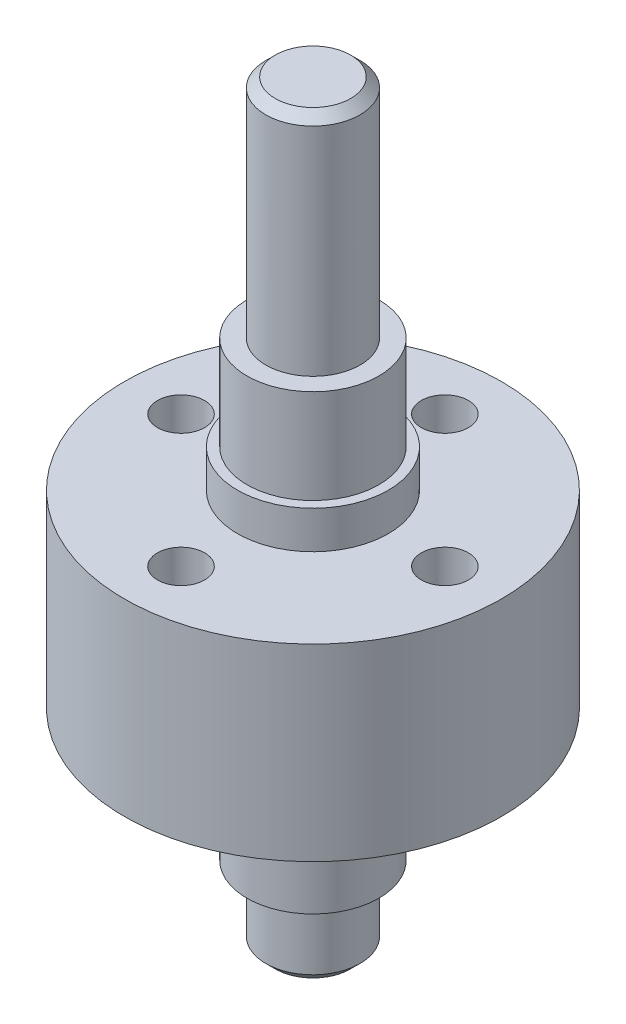
ISO-10303-21;
HEADER;
FILE_DESCRIPTION(('STEP AP214'),'2;1');
FILE_NAME('part.step','',(''),(''),'','','');
FILE_SCHEMA(('AUTOMOTIVE_DESIGN { 1 0 10303 214 1 1 1 1 }'));
ENDSEC;
DATA;
#1=APPLICATION_CONTEXT('core data for automotive mechanical design processes');
#2=APPLICATION_PROTOCOL_DEFINITION('international standard','automotive_design',2000,#1);
#3=PRODUCT_CONTEXT('',#1,'mechanical');
#4=PRODUCT('Part','Part','',(#3));
#5=PRODUCT_RELATED_PRODUCT_CATEGORY('part','',(#4));
#6=PRODUCT_DEFINITION_FORMATION('','',#4);
#7=PRODUCT_DEFINITION_CONTEXT('part definition',#1,'design');
#8=PRODUCT_DEFINITION('design','',#6,#7);
#9=PRODUCT_DEFINITION_SHAPE('','',#8);
#10=(LENGTH_UNIT() NAMED_UNIT(*) SI_UNIT(.MILLI.,.METRE.));
#11=(NAMED_UNIT(*) PLANE_ANGLE_UNIT() SI_UNIT($,.RADIAN.));
#12=(NAMED_UNIT(*) SI_UNIT($,.STERADIAN.) SOLID_ANGLE_UNIT());
#13=UNCERTAINTY_MEASURE_WITH_UNIT(LENGTH_MEASURE(1.E-05),#10,'distance_accuracy_value','');
#14=(GEOMETRIC_REPRESENTATION_CONTEXT(3) GLOBAL_UNCERTAINTY_ASSIGNED_CONTEXT((#13)) GLOBAL_UNIT_ASSIGNED_CONTEXT((#10,
#11,#12)) REPRESENTATION_CONTEXT('',''));
#15=CARTESIAN_POINT('',(0.,0.,0.));
#16=DIRECTION('',(0.,0.,1.));
#17=DIRECTION('',(1.,0.,0.));
#18=AXIS2_PLACEMENT_3D('',#15,#16,#17);
#19=CARTESIAN_POINT('',(2.5,0.,0.));
#20=DIRECTION('',(0.,-1.,0.));
#21=DIRECTION('',(0.,0.,-1.));
#22=AXIS2_PLACEMENT_3D('',#19,#20,#21);
#23=PLANE('',#22);
#24=CARTESIAN_POINT('',(0.,0.,0.));
#25=DIRECTION('',(0.,-1.,0.));
#26=DIRECTION('',(0.,0.,-1.));
#27=AXIS2_PLACEMENT_3D('',#24,#25,#26);
#28=CIRCLE('',#27,1.99999999999999);
#29=CARTESIAN_POINT('',(0.,0.,-1.99999999999999));
#30=VERTEX_POINT('',#29);
#31=EDGE_CURVE('E50',#30,#30,#28,.T.);
#32=ORIENTED_EDGE('',*,*,#31,.T.);
#33=EDGE_LOOP('',(#32));
#34=FACE_BOUND('',#33,.T.);
#35=ADVANCED_FACE('F35',(#34),#23,.T.);
#36=CARTESIAN_POINT('',(0.,40.,0.));
#37=DIRECTION('',(0.,1.,0.));
#38=DIRECTION('',(0.,0.,1.));
#39=AXIS2_PLACEMENT_3D('',#36,#37,#38);
#40=PLANE('',#39);
#41=CARTESIAN_POINT('',(0.,40.,0.));
#42=DIRECTION('',(0.,1.,0.));
#43=DIRECTION('',(0.,0.,1.));
#44=AXIS2_PLACEMENT_3D('',#41,#42,#43);
#45=CIRCLE('',#44,1.99999999999999);
#46=CARTESIAN_POINT('',(0.,40.,1.99999999999999));
#47=VERTEX_POINT('',#46);
#48=EDGE_CURVE('E10',#47,#47,#45,.T.);
#49=ORIENTED_EDGE('',*,*,#48,.T.);
#50=EDGE_LOOP('',(#49));
#51=FACE_BOUND('',#50,.T.);
#52=ADVANCED_FACE('F182',(#51),#40,.T.);
#53=CARTESIAN_POINT('',(0.,0.,0.));
#54=DIRECTION('',(0.,-1.,0.));
#55=DIRECTION('',(0.,0.,-1.));
#56=AXIS2_PLACEMENT_3D('',#53,#54,#55);
#57=CYLINDRICAL_SURFACE('',#56,2.5);
#58=CARTESIAN_POINT('',(0.,39.5,0.));
#59=DIRECTION('',(0.,1.,0.));
#60=DIRECTION('',(0.,0.,1.));
#61=AXIS2_PLACEMENT_3D('',#58,#59,#60);
#62=CIRCLE('',#61,2.5);
#63=CARTESIAN_POINT('',(0.,39.5,2.5));
#64=VERTEX_POINT('',#63);
#65=EDGE_CURVE('E42',#64,#64,#62,.F.);
#66=ORIENTED_EDGE('',*,*,#65,.T.);
#67=EDGE_LOOP('',(#66));
#68=FACE_BOUND('',#67,.T.);
#69=CARTESIAN_POINT('',(0.,28.,0.));
#70=DIRECTION('',(0.,-1.,0.));
#71=DIRECTION('',(0.,0.,-1.));
#72=AXIS2_PLACEMENT_3D('',#69,#70,#71);
#73=CIRCLE('',#72,2.5);
#74=CARTESIAN_POINT('',(0.,28.,-2.5));
#75=VERTEX_POINT('',#74);
#76=EDGE_CURVE('E55',#75,#75,#73,.T.);
#77=ORIENTED_EDGE('',*,*,#76,.F.);
#78=EDGE_LOOP('',(#77));
#79=FACE_BOUND('',#78,.T.);
#80=ADVANCED_FACE('F188',(#68,#79),#57,.T.);
#81=CARTESIAN_POINT('',(2.5,28.,0.));
#82=DIRECTION('',(0.,1.,0.));
#83=DIRECTION('',(0.,0.,1.));
#84=AXIS2_PLACEMENT_3D('',#81,#82,#83);
#85=PLANE('',#84);
#86=ORIENTED_EDGE('',*,*,#76,.T.);
#87=EDGE_LOOP('',(#86));
#88=FACE_BOUND('',#87,.T.);
#89=CARTESIAN_POINT('',(0.,28.,0.));
#90=DIRECTION('',(0.,-1.,0.));
#91=DIRECTION('',(0.,0.,-1.));
#92=AXIS2_PLACEMENT_3D('',#89,#90,#91);
#93=CIRCLE('',#92,3.5);
#94=CARTESIAN_POINT('',(0.,28.,-3.5));
#95=VERTEX_POINT('',#94);
#96=EDGE_CURVE('E67',#95,#95,#93,.T.);
#97=ORIENTED_EDGE('',*,*,#96,.F.);
#98=EDGE_LOOP('',(#97));
#99=FACE_BOUND('',#98,.T.);
#100=ADVANCED_FACE('F252',(#88,#99),#85,.T.);
#101=CARTESIAN_POINT('',(0.,0.,0.));
#102=DIRECTION('',(0.,-1.,0.));
#103=DIRECTION('',(0.,0.,-1.));
#104=AXIS2_PLACEMENT_3D('',#101,#102,#103);
#105=CYLINDRICAL_SURFACE('',#104,3.5);
#106=ORIENTED_EDGE('',*,*,#96,.T.);
#107=EDGE_LOOP('',(#106));
#108=FACE_BOUND('',#107,.T.);
#109=CARTESIAN_POINT('',(0.,23.,0.));
#110=DIRECTION('',(0.,-1.,0.));
#111=DIRECTION('',(0.,0.,-1.));
#112=AXIS2_PLACEMENT_3D('',#109,#110,#111);
#113=CIRCLE('',#112,3.5);
#114=CARTESIAN_POINT('',(0.,23.,-3.5));
#115=VERTEX_POINT('',#114);
#116=EDGE_CURVE('E70',#115,#115,#113,.T.);
#117=ORIENTED_EDGE('',*,*,#116,.F.);
#118=EDGE_LOOP('',(#117));
#119=FACE_BOUND('',#118,.T.);
#120=ADVANCED_FACE('F340',(#108,#119),#105,.T.);
#121=CARTESIAN_POINT('',(3.5,23.,0.));
#122=DIRECTION('',(0.,1.,0.));
#123=DIRECTION('',(0.,0.,1.));
#124=AXIS2_PLACEMENT_3D('',#121,#122,#123);
#125=PLANE('',#124);
#126=ORIENTED_EDGE('',*,*,#116,.T.);
#127=EDGE_LOOP('',(#126));
#128=FACE_BOUND('',#127,.T.);
#129=CARTESIAN_POINT('',(0.,23.,0.));
#130=DIRECTION('',(0.,-1.,0.));
#131=DIRECTION('',(0.,0.,-1.));
#132=AXIS2_PLACEMENT_3D('',#129,#130,#131);
#133=CIRCLE('',#132,4.);
#134=CARTESIAN_POINT('',(0.,23.,-4.));
#135=VERTEX_POINT('',#134);
#136=EDGE_CURVE('E73',#135,#135,#133,.T.);
#137=ORIENTED_EDGE('',*,*,#136,.F.);
#138=EDGE_LOOP('',(#137));
#139=FACE_BOUND('',#138,.T.);
#140=ADVANCED_FACE('F330',(#128,#139),#125,.T.);
#141=CARTESIAN_POINT('',(0.,0.,0.));
#142=DIRECTION('',(0.,-1.,0.));
#143=DIRECTION('',(0.,0.,-1.));
#144=AXIS2_PLACEMENT_3D('',#141,#142,#143);
#145=CYLINDRICAL_SURFACE('',#144,4.);
#146=ORIENTED_EDGE('',*,*,#136,.T.);
#147=EDGE_LOOP('',(#146));
#148=FACE_BOUND('',#147,.T.);
#149=CARTESIAN_POINT('',(0.,21.,0.));
#150=DIRECTION('',(0.,-1.,0.));
#151=DIRECTION('',(0.,0.,-1.));
#152=AXIS2_PLACEMENT_3D('',#149,#150,#151);
#153=CIRCLE('',#152,4.);
#154=CARTESIAN_POINT('',(0.,21.,-4.));
#155=VERTEX_POINT('',#154);
#156=EDGE_CURVE('E76',#155,#155,#153,.T.);
#157=ORIENTED_EDGE('',*,*,#156,.F.);
#158=EDGE_LOOP('',(#157));
#159=FACE_BOUND('',#158,.T.);
#160=ADVANCED_FACE('F122',(#148,#159),#145,.T.);
#161=CARTESIAN_POINT('',(4.,21.,0.));
#162=DIRECTION('',(0.,1.,0.));
#163=DIRECTION('',(0.,0.,1.));
#164=AXIS2_PLACEMENT_3D('',#161,#162,#163);
#165=PLANE('',#164);
#166=CARTESIAN_POINT('',(0.,21.,-7.));
#167=DIRECTION('',(0.,1.,0.));
#168=DIRECTION('',(0.,0.,1.));
#169=AXIS2_PLACEMENT_3D('',#166,#167,#168);
#170=CIRCLE('',#169,1.24999999999999);
#171=CARTESIAN_POINT('',(0.,21.,-5.75000000000001));
#172=VERTEX_POINT('',#171);
#173=EDGE_CURVE('E60',#172,#172,#170,.T.);
#174=ORIENTED_EDGE('',*,*,#173,.F.);
#175=EDGE_LOOP('',(#174));
#176=FACE_BOUND('',#175,.T.);
#177=CARTESIAN_POINT('',(7.,21.,0.));
#178=DIRECTION('',(0.,1.,0.));
#179=DIRECTION('',(0.,0.,1.));
#180=AXIS2_PLACEMENT_3D('',#177,#178,#179);
#181=CIRCLE('',#180,1.24999999999999);
#182=CARTESIAN_POINT('',(7.,21.,1.24999999999999));
#183=VERTEX_POINT('',#182);
#184=EDGE_CURVE('E59',#183,#183,#181,.T.);
#185=ORIENTED_EDGE('',*,*,#184,.F.);
#186=EDGE_LOOP('',(#185));
#187=FACE_BOUND('',#186,.T.);
#188=CARTESIAN_POINT('',(0.,21.,7.));
#189=DIRECTION('',(0.,1.,0.));
#190=DIRECTION('',(0.,0.,1.));
#191=AXIS2_PLACEMENT_3D('',#188,#189,#190);
#192=CIRCLE('',#191,1.24999999999999);
#193=CARTESIAN_POINT('',(0.,21.,8.24999999999999));
#194=VERTEX_POINT('',#193);
#195=EDGE_CURVE('E64',#194,#194,#192,.T.);
#196=ORIENTED_EDGE('',*,*,#195,.F.);
#197=EDGE_LOOP('',(#196));
#198=FACE_BOUND('',#197,.T.);
#199=CARTESIAN_POINT('',(-7.,21.,0.));
#200=DIRECTION('',(0.,1.,0.));
#201=DIRECTION('',(0.,0.,1.));
#202=AXIS2_PLACEMENT_3D('',#199,#200,#201);
#203=CIRCLE('',#202,1.24999999999999);
#204=CARTESIAN_POINT('',(-7.,21.,1.24999999999999));
#205=VERTEX_POINT('',#204);
#206=EDGE_CURVE('E103',#205,#205,#203,.T.);
#207=ORIENTED_EDGE('',*,*,#206,.F.);
#208=EDGE_LOOP('',(#207));
#209=FACE_BOUND('',#208,.T.);
#210=ORIENTED_EDGE('',*,*,#156,.T.);
#211=EDGE_LOOP('',(#210));
#212=FACE_BOUND('',#211,.T.);
#213=CARTESIAN_POINT('',(0.,21.,0.));
#214=DIRECTION('',(0.,-1.,0.));
#215=DIRECTION('',(0.,0.,-1.));
#216=AXIS2_PLACEMENT_3D('',#213,#214,#215);
#217=CIRCLE('',#216,10.);
#218=CARTESIAN_POINT('',(0.,21.,-10.));
#219=VERTEX_POINT('',#218);
#220=EDGE_CURVE('E79',#219,#219,#217,.T.);
#221=ORIENTED_EDGE('',*,*,#220,.F.);
#222=EDGE_LOOP('',(#221));
#223=FACE_BOUND('',#222,.T.);
#224=ADVANCED_FACE('F118',(#176,#187,#198,#209,#212,#223),#165,.T.);
#225=CARTESIAN_POINT('',(0.,0.,0.));
#226=DIRECTION('',(0.,-1.,0.));
#227=DIRECTION('',(0.,0.,-1.));
#228=AXIS2_PLACEMENT_3D('',#225,#226,#227);
#229=CYLINDRICAL_SURFACE('',#228,10.);
#230=ORIENTED_EDGE('',*,*,#220,.T.);
#231=EDGE_LOOP('',(#230));
#232=FACE_BOUND('',#231,.T.);
#233=CARTESIAN_POINT('',(0.,11.,0.));
#234=DIRECTION('',(0.,-1.,0.));
#235=DIRECTION('',(0.,0.,-1.));
#236=AXIS2_PLACEMENT_3D('',#233,#234,#235);
#237=CIRCLE('',#236,10.);
#238=CARTESIAN_POINT('',(0.,11.,-10.));
#239=VERTEX_POINT('',#238);
#240=EDGE_CURVE('E82',#239,#239,#237,.T.);
#241=ORIENTED_EDGE('',*,*,#240,.F.);
#242=EDGE_LOOP('',(#241));
#243=FACE_BOUND('',#242,.T.);
#244=ADVANCED_FACE('F121',(#232,#243),#229,.T.);
#245=CARTESIAN_POINT('',(10.,11.,0.));
#246=DIRECTION('',(0.,-1.,0.));
#247=DIRECTION('',(0.,0.,-1.));
#248=AXIS2_PLACEMENT_3D('',#245,#246,#247);
#249=PLANE('',#248);
#250=CARTESIAN_POINT('',(0.,11.,-7.));
#251=DIRECTION('',(0.,-1.,0.));
#252=DIRECTION('',(0.,0.,-1.));
#253=AXIS2_PLACEMENT_3D('',#250,#251,#252);
#254=CIRCLE('',#253,1.24999999999999);
#255=CARTESIAN_POINT('',(0.,11.,-8.24999999999999));
#256=VERTEX_POINT('',#255);
#257=EDGE_CURVE('E56',#256,#256,#254,.T.);
#258=ORIENTED_EDGE('',*,*,#257,.F.);
#259=EDGE_LOOP('',(#258));
#260=FACE_BOUND('',#259,.T.);
#261=CARTESIAN_POINT('',(7.,11.,0.));
#262=DIRECTION('',(0.,-1.,0.));
#263=DIRECTION('',(0.,0.,-1.));
#264=AXIS2_PLACEMENT_3D('',#261,#262,#263);
#265=CIRCLE('',#264,1.24999999999999);
#266=CARTESIAN_POINT('',(7.,11.,-1.24999999999999));
#267=VERTEX_POINT('',#266);
#268=EDGE_CURVE('E61',#267,#267,#265,.T.);
#269=ORIENTED_EDGE('',*,*,#268,.F.);
#270=EDGE_LOOP('',(#269));
#271=FACE_BOUND('',#270,.T.);
#272=CARTESIAN_POINT('',(0.,11.,7.));
#273=DIRECTION('',(0.,-1.,0.));
#274=DIRECTION('',(0.,0.,-1.));
#275=AXIS2_PLACEMENT_3D('',#272,#273,#274);
#276=CIRCLE('',#275,1.24999999999999);
#277=CARTESIAN_POINT('',(0.,11.,5.75000000000001));
#278=VERTEX_POINT('',#277);
#279=EDGE_CURVE('E106',#278,#278,#276,.T.);
#280=ORIENTED_EDGE('',*,*,#279,.F.);
#281=EDGE_LOOP('',(#280));
#282=FACE_BOUND('',#281,.T.);
#283=CARTESIAN_POINT('',(-7.,11.,0.));
#284=DIRECTION('',(0.,-1.,0.));
#285=DIRECTION('',(0.,0.,-1.));
#286=AXIS2_PLACEMENT_3D('',#283,#284,#285);
#287=CIRCLE('',#286,1.24999999999999);
#288=CARTESIAN_POINT('',(-7.,11.,-1.24999999999999));
#289=VERTEX_POINT('',#288);
#290=EDGE_CURVE('E100',#289,#289,#287,.T.);
#291=ORIENTED_EDGE('',*,*,#290,.F.);
#292=EDGE_LOOP('',(#291));
#293=FACE_BOUND('',#292,.T.);
#294=ORIENTED_EDGE('',*,*,#240,.T.);
#295=EDGE_LOOP('',(#294));
#296=FACE_BOUND('',#295,.T.);
#297=CARTESIAN_POINT('',(0.,11.,0.));
#298=DIRECTION('',(0.,-1.,0.));
#299=DIRECTION('',(0.,0.,-1.));
#300=AXIS2_PLACEMENT_3D('',#297,#298,#299);
#301=CIRCLE('',#300,4.);
#302=CARTESIAN_POINT('',(0.,11.,-4.));
#303=VERTEX_POINT('',#302);
#304=EDGE_CURVE('E85',#303,#303,#301,.T.);
#305=ORIENTED_EDGE('',*,*,#304,.F.);
#306=EDGE_LOOP('',(#305));
#307=FACE_BOUND('',#306,.T.);
#308=ADVANCED_FACE('F136',(#260,#271,#282,#293,#296,#307),#249,.T.);
#309=CARTESIAN_POINT('',(0.,0.,0.));
#310=DIRECTION('',(0.,-1.,0.));
#311=DIRECTION('',(0.,0.,-1.));
#312=AXIS2_PLACEMENT_3D('',#309,#310,#311);
#313=CYLINDRICAL_SURFACE('',#312,4.);
#314=ORIENTED_EDGE('',*,*,#304,.T.);
#315=EDGE_LOOP('',(#314));
#316=FACE_BOUND('',#315,.T.);
#317=CARTESIAN_POINT('',(0.,9.,0.));
#318=DIRECTION('',(0.,-1.,0.));
#319=DIRECTION('',(0.,0.,-1.));
#320=AXIS2_PLACEMENT_3D('',#317,#318,#319);
#321=CIRCLE('',#320,4.);
#322=CARTESIAN_POINT('',(0.,9.,-4.));
#323=VERTEX_POINT('',#322);
#324=EDGE_CURVE('E88',#323,#323,#321,.T.);
#325=ORIENTED_EDGE('',*,*,#324,.F.);
#326=EDGE_LOOP('',(#325));
#327=FACE_BOUND('',#326,.T.);
#328=ADVANCED_FACE('F142',(#316,#327),#313,.T.);
#329=CARTESIAN_POINT('',(4.,9.,0.));
#330=DIRECTION('',(0.,-1.,0.));
#331=DIRECTION('',(0.,0.,-1.));
#332=AXIS2_PLACEMENT_3D('',#329,#330,#331);
#333=PLANE('',#332);
#334=ORIENTED_EDGE('',*,*,#324,.T.);
#335=EDGE_LOOP('',(#334));
#336=FACE_BOUND('',#335,.T.);
#337=CARTESIAN_POINT('',(0.,9.,0.));
#338=DIRECTION('',(0.,-1.,0.));
#339=DIRECTION('',(0.,0.,-1.));
#340=AXIS2_PLACEMENT_3D('',#337,#338,#339);
#341=CIRCLE('',#340,3.5);
#342=CARTESIAN_POINT('',(0.,9.,-3.5));
#343=VERTEX_POINT('',#342);
#344=EDGE_CURVE('E91',#343,#343,#341,.T.);
#345=ORIENTED_EDGE('',*,*,#344,.F.);
#346=EDGE_LOOP('',(#345));
#347=FACE_BOUND('',#346,.T.);
#348=ADVANCED_FACE('F149',(#336,#347),#333,.T.);
#349=CARTESIAN_POINT('',(0.,0.,0.));
#350=DIRECTION('',(0.,-1.,0.));
#351=DIRECTION('',(0.,0.,-1.));
#352=AXIS2_PLACEMENT_3D('',#349,#350,#351);
#353=CYLINDRICAL_SURFACE('',#352,3.5);
#354=ORIENTED_EDGE('',*,*,#344,.T.);
#355=EDGE_LOOP('',(#354));
#356=FACE_BOUND('',#355,.T.);
#357=CARTESIAN_POINT('',(0.,4.,0.));
#358=DIRECTION('',(0.,-1.,0.));
#359=DIRECTION('',(0.,0.,-1.));
#360=AXIS2_PLACEMENT_3D('',#357,#358,#359);
#361=CIRCLE('',#360,3.5);
#362=CARTESIAN_POINT('',(0.,4.,-3.5));
#363=VERTEX_POINT('',#362);
#364=EDGE_CURVE('E94',#363,#363,#361,.T.);
#365=ORIENTED_EDGE('',*,*,#364,.F.);
#366=EDGE_LOOP('',(#365));
#367=FACE_BOUND('',#366,.T.);
#368=ADVANCED_FACE('F155',(#356,#367),#353,.T.);
#369=CARTESIAN_POINT('',(2.5,4.,0.));
#370=DIRECTION('',(0.,-1.,0.));
#371=DIRECTION('',(0.,0.,-1.));
#372=AXIS2_PLACEMENT_3D('',#369,#370,#371);
#373=PLANE('',#372);
#374=ORIENTED_EDGE('',*,*,#364,.T.);
#375=EDGE_LOOP('',(#374));
#376=FACE_BOUND('',#375,.T.);
#377=CARTESIAN_POINT('',(0.,4.,0.));
#378=DIRECTION('',(0.,-1.,0.));
#379=DIRECTION('',(0.,0.,-1.));
#380=AXIS2_PLACEMENT_3D('',#377,#378,#379);
#381=CIRCLE('',#380,2.5);
#382=CARTESIAN_POINT('',(0.,4.,-2.5));
#383=VERTEX_POINT('',#382);
#384=EDGE_CURVE('E97',#383,#383,#381,.T.);
#385=ORIENTED_EDGE('',*,*,#384,.F.);
#386=EDGE_LOOP('',(#385));
#387=FACE_BOUND('',#386,.T.);
#388=ADVANCED_FACE('F161',(#376,#387),#373,.T.);
#389=CARTESIAN_POINT('',(0.,0.,0.));
#390=DIRECTION('',(0.,-1.,0.));
#391=DIRECTION('',(0.,0.,-1.));
#392=AXIS2_PLACEMENT_3D('',#389,#390,#391);
#393=CYLINDRICAL_SURFACE('',#392,2.5);
#394=CARTESIAN_POINT('',(0.,0.500000000000007,0.));
#395=DIRECTION('',(0.,-1.,0.));
#396=DIRECTION('',(0.,0.,-1.));
#397=AXIS2_PLACEMENT_3D('',#394,#395,#396);
#398=CIRCLE('',#397,2.5);
#399=CARTESIAN_POINT('',(0.,0.500000000000007,-2.5));
#400=VERTEX_POINT('',#399);
#401=EDGE_CURVE('E46',#400,#400,#398,.F.);
#402=ORIENTED_EDGE('',*,*,#401,.T.);
#403=EDGE_LOOP('',(#402));
#404=FACE_BOUND('',#403,.T.);
#405=ORIENTED_EDGE('',*,*,#384,.T.);
#406=EDGE_LOOP('',(#405));
#407=FACE_BOUND('',#406,.T.);
#408=ADVANCED_FACE('F167',(#404,#407),#393,.T.);
#409=CARTESIAN_POINT('',(-7.,21.,0.));
#410=DIRECTION('',(0.,1.,0.));
#411=DIRECTION('',(0.,0.,1.));
#412=AXIS2_PLACEMENT_3D('',#409,#410,#411);
#413=CYLINDRICAL_SURFACE('',#412,1.24999999999999);
#414=ORIENTED_EDGE('',*,*,#290,.T.);
#415=EDGE_LOOP('',(#414));
#416=FACE_BOUND('',#415,.T.);
#417=ORIENTED_EDGE('',*,*,#206,.T.);
#418=EDGE_LOOP('',(#417));
#419=FACE_BOUND('',#418,.T.);
#420=ADVANCED_FACE('F172',(#416,#419),#413,.F.);
#421=CARTESIAN_POINT('',(0.,21.,7.));
#422=DIRECTION('',(0.,1.,0.));
#423=DIRECTION('',(0.,0.,1.));
#424=AXIS2_PLACEMENT_3D('',#421,#422,#423);
#425=CYLINDRICAL_SURFACE('',#424,1.24999999999999);
#426=ORIENTED_EDGE('',*,*,#279,.T.);
#427=EDGE_LOOP('',(#426));
#428=FACE_BOUND('',#427,.T.);
#429=ORIENTED_EDGE('',*,*,#195,.T.);
#430=EDGE_LOOP('',(#429));
#431=FACE_BOUND('',#430,.T.);
#432=ADVANCED_FACE('F178',(#428,#431),#425,.F.);
#433=CARTESIAN_POINT('',(7.,21.,0.));
#434=DIRECTION('',(0.,1.,0.));
#435=DIRECTION('',(0.,0.,1.));
#436=AXIS2_PLACEMENT_3D('',#433,#434,#435);
#437=CYLINDRICAL_SURFACE('',#436,1.24999999999999);
#438=ORIENTED_EDGE('',*,*,#268,.T.);
#439=EDGE_LOOP('',(#438));
#440=FACE_BOUND('',#439,.T.);
#441=ORIENTED_EDGE('',*,*,#184,.T.);
#442=EDGE_LOOP('',(#441));
#443=FACE_BOUND('',#442,.T.);
#444=ADVANCED_FACE('F199',(#440,#443),#437,.F.);
#445=CARTESIAN_POINT('',(0.,21.,-7.));
#446=DIRECTION('',(0.,1.,0.));
#447=DIRECTION('',(0.,0.,1.));
#448=AXIS2_PLACEMENT_3D('',#445,#446,#447);
#449=CYLINDRICAL_SURFACE('',#448,1.24999999999999);
#450=ORIENTED_EDGE('',*,*,#257,.T.);
#451=EDGE_LOOP('',(#450));
#452=FACE_BOUND('',#451,.T.);
#453=ORIENTED_EDGE('',*,*,#173,.T.);
#454=EDGE_LOOP('',(#453));
#455=FACE_BOUND('',#454,.T.);
#456=ADVANCED_FACE('F116',(#452,#455),#449,.F.);
#457=CARTESIAN_POINT('',(0.,0.,0.));
#458=DIRECTION('',(0.,1.,0.));
#459=DIRECTION('',(0.,0.,1.));
#460=AXIS2_PLACEMENT_3D('',#457,#458,#459);
#461=CONICAL_SURFACE('',#460,1.99999999999999,0.785398163397447);
#462=ORIENTED_EDGE('',*,*,#401,.F.);
#463=EDGE_LOOP('',(#462));
#464=FACE_BOUND('',#463,.T.);
#465=ORIENTED_EDGE('',*,*,#31,.F.);
#466=EDGE_LOOP('',(#465));
#467=FACE_BOUND('',#466,.T.);
#468=ADVANCED_FACE('F191',(#464,#467),#461,.T.);
#469=CARTESIAN_POINT('',(0.,39.5,0.));
#470=DIRECTION('',(0.,-1.,0.));
#471=DIRECTION('',(0.,0.,-1.));
#472=AXIS2_PLACEMENT_3D('',#469,#470,#471);
#473=CONICAL_SURFACE('',#472,2.5,0.785398163397446);
#474=ORIENTED_EDGE('',*,*,#48,.F.);
#475=EDGE_LOOP('',(#474));
#476=FACE_BOUND('',#475,.T.);
#477=ORIENTED_EDGE('',*,*,#65,.F.);
#478=EDGE_LOOP('',(#477));
#479=FACE_BOUND('',#478,.T.);
#480=ADVANCED_FACE('F37',(#476,#479),#473,.T.);
#481=CLOSED_SHELL('',(#35,#52,#80,#100,#120,#140,#160,#224,#244,#308,#328,#348,#368,#388,#408,
#420,#432,#444,#456,#468,#480));
#482=MANIFOLD_SOLID_BREP('B2',#481);
#483=ADVANCED_BREP_SHAPE_REPRESENTATION('',(#18,#482),#14);
#484=SHAPE_DEFINITION_REPRESENTATION(#9,#483);
ENDSEC;
END-ISO-10303-21;
